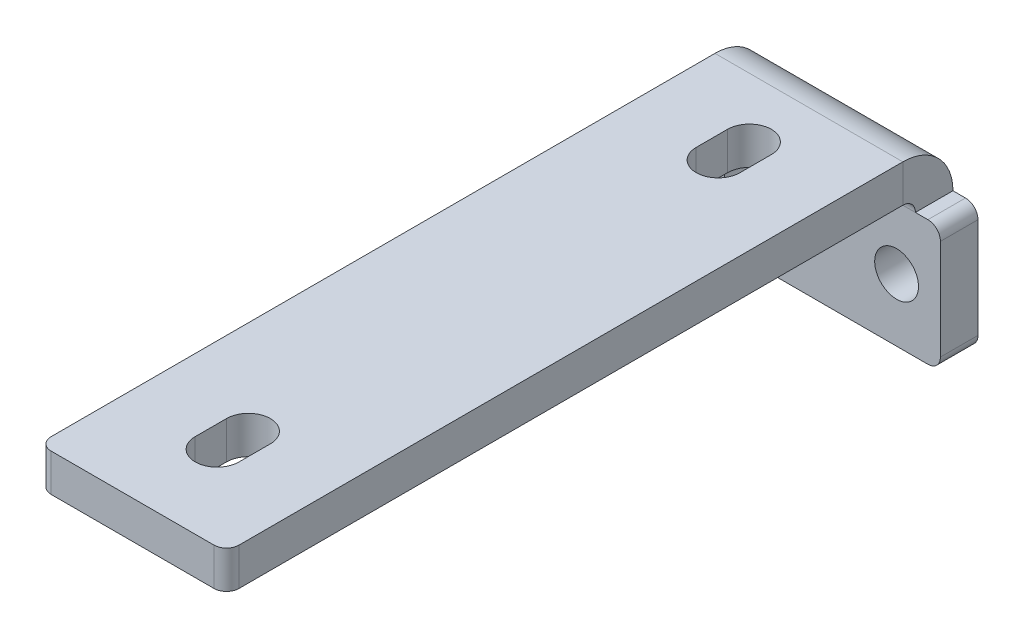
ISO-10303-21;
HEADER;
FILE_DESCRIPTION(('STEP AP214'),'2;1');
FILE_NAME('part.step','',(''),(''),'','','');
FILE_SCHEMA(('AUTOMOTIVE_DESIGN { 1 0 10303 214 1 1 1 1 }'));
ENDSEC;
DATA;
#1=APPLICATION_CONTEXT('core data for automotive mechanical design processes');
#2=APPLICATION_PROTOCOL_DEFINITION('international standard','automotive_design',2000,#1);
#3=PRODUCT_CONTEXT('',#1,'mechanical');
#4=PRODUCT('Part','Part','',(#3));
#5=PRODUCT_RELATED_PRODUCT_CATEGORY('part','',(#4));
#6=PRODUCT_DEFINITION_FORMATION('','',#4);
#7=PRODUCT_DEFINITION_CONTEXT('part definition',#1,'design');
#8=PRODUCT_DEFINITION('design','',#6,#7);
#9=PRODUCT_DEFINITION_SHAPE('','',#8);
#10=(LENGTH_UNIT() NAMED_UNIT(*) SI_UNIT(.MILLI.,.METRE.));
#11=(NAMED_UNIT(*) PLANE_ANGLE_UNIT() SI_UNIT($,.RADIAN.));
#12=(NAMED_UNIT(*) SI_UNIT($,.STERADIAN.) SOLID_ANGLE_UNIT());
#13=UNCERTAINTY_MEASURE_WITH_UNIT(LENGTH_MEASURE(1.E-05),#10,'distance_accuracy_value','');
#14=(GEOMETRIC_REPRESENTATION_CONTEXT(3) GLOBAL_UNCERTAINTY_ASSIGNED_CONTEXT((#13)) GLOBAL_UNIT_ASSIGNED_CONTEXT((#10,
#11,#12)) REPRESENTATION_CONTEXT('',''));
#15=CARTESIAN_POINT('',(0.,0.,0.));
#16=DIRECTION('',(0.,0.,1.));
#17=DIRECTION('',(1.,0.,0.));
#18=AXIS2_PLACEMENT_3D('',#15,#16,#17);
#19=CARTESIAN_POINT('',(0.,0.,-3.));
#20=DIRECTION('',(0.,1.,0.));
#21=DIRECTION('',(-1.,0.,0.));
#22=AXIS2_PLACEMENT_3D('',#19,#20,#21);
#23=PLANE('',#22);
#24=DIRECTION('',(-1.,0.,0.));
#25=VECTOR('',#24,1.);
#26=CARTESIAN_POINT('',(0.,0.,-3.));
#27=LINE('',#26,#25);
#28=CARTESIAN_POINT('',(2.,0.,-3.));
#29=VERTEX_POINT('',#28);
#30=CARTESIAN_POINT('',(1.,0.,-3.));
#31=VERTEX_POINT('',#30);
#32=EDGE_CURVE('E367',#29,#31,#27,.T.);
#33=ORIENTED_EDGE('',*,*,#32,.T.);
#34=DIRECTION('',(0.,0.,1.));
#35=VECTOR('',#34,1.);
#36=CARTESIAN_POINT('',(1.,0.,-3.));
#37=LINE('',#36,#35);
#38=CARTESIAN_POINT('',(1.,0.,0.));
#39=VERTEX_POINT('',#38);
#40=EDGE_CURVE('E348',#31,#39,#37,.T.);
#41=ORIENTED_EDGE('',*,*,#40,.T.);
#42=DIRECTION('',(-1.,0.,0.));
#43=VECTOR('',#42,1.);
#44=CARTESIAN_POINT('',(0.,0.,0.));
#45=LINE('',#44,#43);
#46=CARTESIAN_POINT('',(2.,0.,0.));
#47=VERTEX_POINT('',#46);
#48=EDGE_CURVE('E357',#47,#39,#45,.T.);
#49=ORIENTED_EDGE('',*,*,#48,.F.);
#50=DIRECTION('',(0.,0.,-1.));
#51=VECTOR('',#50,1.);
#52=CARTESIAN_POINT('',(2.,0.,0.));
#53=LINE('',#52,#51);
#54=EDGE_CURVE('E332',#47,#29,#53,.T.);
#55=ORIENTED_EDGE('',*,*,#54,.T.);
#56=EDGE_LOOP('',(#33,#41,#49,#55));
#57=FACE_BOUND('',#56,.T.);
#58=ADVANCED_FACE('F59',(#57),#23,.T.);
#59=CARTESIAN_POINT('',(0.,0.,-3.));
#60=DIRECTION('',(-1.,0.,0.));
#61=DIRECTION('',(0.,0.,1.));
#62=AXIS2_PLACEMENT_3D('',#59,#60,#61);
#63=PLANE('',#62);
#64=DIRECTION('',(0.,-1.,0.));
#65=VECTOR('',#64,1.);
#66=CARTESIAN_POINT('',(0.,0.,0.));
#67=LINE('',#66,#65);
#68=CARTESIAN_POINT('',(0.,-1.,0.));
#69=VERTEX_POINT('',#68);
#70=CARTESIAN_POINT('',(0.,-9.,0.));
#71=VERTEX_POINT('',#70);
#72=EDGE_CURVE('E377',#69,#71,#67,.T.);
#73=ORIENTED_EDGE('',*,*,#72,.F.);
#74=DIRECTION('',(0.,0.,1.));
#75=VECTOR('',#74,1.);
#76=CARTESIAN_POINT('',(0.,-1.,-3.));
#77=LINE('',#76,#75);
#78=CARTESIAN_POINT('',(0.,-1.,-3.));
#79=VERTEX_POINT('',#78);
#80=EDGE_CURVE('E382',#69,#79,#77,.F.);
#81=ORIENTED_EDGE('',*,*,#80,.T.);
#82=DIRECTION('',(0.,-1.,0.));
#83=VECTOR('',#82,1.);
#84=CARTESIAN_POINT('',(0.,0.,-3.));
#85=LINE('',#84,#83);
#86=CARTESIAN_POINT('',(0.,-9.,-3.));
#87=VERTEX_POINT('',#86);
#88=EDGE_CURVE('E356',#79,#87,#85,.T.);
#89=ORIENTED_EDGE('',*,*,#88,.T.);
#90=DIRECTION('',(0.,0.,1.));
#91=VECTOR('',#90,1.);
#92=CARTESIAN_POINT('',(0.,-9.,-3.));
#93=LINE('',#92,#91);
#94=EDGE_CURVE('E434',#87,#71,#93,.T.);
#95=ORIENTED_EDGE('',*,*,#94,.T.);
#96=EDGE_LOOP('',(#73,#81,#89,#95));
#97=FACE_BOUND('',#96,.T.);
#98=ADVANCED_FACE('F459',(#97),#63,.T.);
#99=CARTESIAN_POINT('',(18.,0.,0.));
#100=VERTEX_POINT('',#99);
#101=CARTESIAN_POINT('',(17.,0.,0.));
#102=VERTEX_POINT('',#101);
#103=EDGE_CURVE('E353',#100,#102,#45,.T.);
#104=ORIENTED_EDGE('',*,*,#103,.F.);
#105=DIRECTION('',(0.,0.,1.));
#106=VECTOR('',#105,1.);
#107=CARTESIAN_POINT('',(18.,0.,-3.));
#108=LINE('',#107,#106);
#109=CARTESIAN_POINT('',(18.,0.,-3.));
#110=VERTEX_POINT('',#109);
#111=EDGE_CURVE('E397',#100,#110,#108,.F.);
#112=ORIENTED_EDGE('',*,*,#111,.T.);
#113=CARTESIAN_POINT('',(17.,0.,-3.));
#114=VERTEX_POINT('',#113);
#115=EDGE_CURVE('E352',#110,#114,#27,.T.);
#116=ORIENTED_EDGE('',*,*,#115,.T.);
#117=DIRECTION('',(0.,0.,-1.));
#118=VECTOR('',#117,1.);
#119=CARTESIAN_POINT('',(17.,0.,0.));
#120=LINE('',#119,#118);
#121=EDGE_CURVE('E327',#102,#114,#120,.T.);
#122=ORIENTED_EDGE('',*,*,#121,.F.);
#123=EDGE_LOOP('',(#104,#112,#116,#122));
#124=FACE_BOUND('',#123,.T.);
#125=ADVANCED_FACE('F530',(#124),#23,.T.);
#126=CARTESIAN_POINT('',(19.,0.,-3.));
#127=DIRECTION('',(1.,0.,0.));
#128=DIRECTION('',(0.,0.,-1.));
#129=AXIS2_PLACEMENT_3D('',#126,#127,#128);
#130=PLANE('',#129);
#131=DIRECTION('',(0.,1.,0.));
#132=VECTOR('',#131,1.);
#133=CARTESIAN_POINT('',(19.,0.,-3.));
#134=LINE('',#133,#132);
#135=CARTESIAN_POINT('',(19.,-9.,-3.));
#136=VERTEX_POINT('',#135);
#137=CARTESIAN_POINT('',(19.,-1.,-3.));
#138=VERTEX_POINT('',#137);
#139=EDGE_CURVE('E371',#136,#138,#134,.T.);
#140=ORIENTED_EDGE('',*,*,#139,.T.);
#141=DIRECTION('',(0.,0.,1.));
#142=VECTOR('',#141,1.);
#143=CARTESIAN_POINT('',(19.,-1.,-3.));
#144=LINE('',#143,#142);
#145=CARTESIAN_POINT('',(19.,-1.,0.));
#146=VERTEX_POINT('',#145);
#147=EDGE_CURVE('E394',#138,#146,#144,.T.);
#148=ORIENTED_EDGE('',*,*,#147,.T.);
#149=DIRECTION('',(0.,1.,0.));
#150=VECTOR('',#149,1.);
#151=CARTESIAN_POINT('',(19.,0.,0.));
#152=LINE('',#151,#150);
#153=CARTESIAN_POINT('',(19.,-9.,0.));
#154=VERTEX_POINT('',#153);
#155=EDGE_CURVE('E362',#154,#146,#152,.T.);
#156=ORIENTED_EDGE('',*,*,#155,.F.);
#157=DIRECTION('',(0.,0.,1.));
#158=VECTOR('',#157,1.);
#159=CARTESIAN_POINT('',(19.,-9.,-3.));
#160=LINE('',#159,#158);
#161=EDGE_CURVE('E392',#154,#136,#160,.F.);
#162=ORIENTED_EDGE('',*,*,#161,.T.);
#163=EDGE_LOOP('',(#140,#148,#156,#162));
#164=FACE_BOUND('',#163,.T.);
#165=ADVANCED_FACE('F538',(#164),#130,.T.);
#166=CARTESIAN_POINT('',(0.,-10.,-3.));
#167=DIRECTION('',(0.,-1.,0.));
#168=DIRECTION('',(1.,0.,0.));
#169=AXIS2_PLACEMENT_3D('',#166,#167,#168);
#170=PLANE('',#169);
#171=DIRECTION('',(1.,0.,0.));
#172=VECTOR('',#171,1.);
#173=CARTESIAN_POINT('',(0.,-10.,-3.));
#174=LINE('',#173,#172);
#175=CARTESIAN_POINT('',(1.,-10.,-3.));
#176=VERTEX_POINT('',#175);
#177=CARTESIAN_POINT('',(18.,-10.,-3.));
#178=VERTEX_POINT('',#177);
#179=EDGE_CURVE('E420',#176,#178,#174,.T.);
#180=ORIENTED_EDGE('',*,*,#179,.T.);
#181=DIRECTION('',(0.,0.,1.));
#182=VECTOR('',#181,1.);
#183=CARTESIAN_POINT('',(18.,-10.,-3.));
#184=LINE('',#183,#182);
#185=CARTESIAN_POINT('',(18.,-10.,0.));
#186=VERTEX_POINT('',#185);
#187=EDGE_CURVE('E13',#178,#186,#184,.T.);
#188=ORIENTED_EDGE('',*,*,#187,.T.);
#189=DIRECTION('',(1.,0.,0.));
#190=VECTOR('',#189,1.);
#191=CARTESIAN_POINT('',(0.,-10.,0.));
#192=LINE('',#191,#190);
#193=CARTESIAN_POINT('',(1.,-10.,0.));
#194=VERTEX_POINT('',#193);
#195=EDGE_CURVE('E423',#194,#186,#192,.T.);
#196=ORIENTED_EDGE('',*,*,#195,.F.);
#197=DIRECTION('',(0.,0.,1.));
#198=VECTOR('',#197,1.);
#199=CARTESIAN_POINT('',(1.,-10.,-3.));
#200=LINE('',#199,#198);
#201=EDGE_CURVE('E67',#194,#176,#200,.F.);
#202=ORIENTED_EDGE('',*,*,#201,.T.);
#203=EDGE_LOOP('',(#180,#188,#196,#202));
#204=FACE_BOUND('',#203,.T.);
#205=ADVANCED_FACE('F419',(#204),#170,.T.);
#206=CARTESIAN_POINT('',(0.,0.,-3.));
#207=DIRECTION('',(0.,0.,1.));
#208=DIRECTION('',(1.,0.,0.));
#209=AXIS2_PLACEMENT_3D('',#206,#207,#208);
#210=PLANE('',#209);
#211=CARTESIAN_POINT('',(15.5,-5.,-3.));
#212=DIRECTION('',(0.,0.,1.));
#213=DIRECTION('',(-1.,0.,0.));
#214=AXIS2_PLACEMENT_3D('',#211,#212,#213);
#215=CIRCLE('',#214,1.75);
#216=CARTESIAN_POINT('',(13.75,-5.,-3.));
#217=VERTEX_POINT('',#216);
#218=EDGE_CURVE('E455',#217,#217,#215,.T.);
#219=ORIENTED_EDGE('',*,*,#218,.T.);
#220=EDGE_LOOP('',(#219));
#221=FACE_BOUND('',#220,.T.);
#222=CARTESIAN_POINT('',(3.5,-5.,-3.));
#223=DIRECTION('',(0.,0.,1.));
#224=DIRECTION('',(1.,0.,0.));
#225=AXIS2_PLACEMENT_3D('',#222,#223,#224);
#226=CIRCLE('',#225,1.75);
#227=CARTESIAN_POINT('',(5.25,-5.,-3.));
#228=VERTEX_POINT('',#227);
#229=EDGE_CURVE('E448',#228,#228,#226,.T.);
#230=ORIENTED_EDGE('',*,*,#229,.T.);
#231=EDGE_LOOP('',(#230));
#232=FACE_BOUND('',#231,.T.);
#233=ORIENTED_EDGE('',*,*,#88,.F.);
#234=CARTESIAN_POINT('',(1.,-1.,-3.));
#235=DIRECTION('',(0.,0.,1.));
#236=DIRECTION('',(1.,0.,0.));
#237=AXIS2_PLACEMENT_3D('',#234,#235,#236);
#238=CIRCLE('',#237,1.);
#239=EDGE_CURVE('E390',#79,#31,#238,.F.);
#240=ORIENTED_EDGE('',*,*,#239,.T.);
#241=ORIENTED_EDGE('',*,*,#32,.F.);
#242=DIRECTION('',(-1.,0.,0.));
#243=VECTOR('',#242,1.);
#244=CARTESIAN_POINT('',(2.,0.,-3.));
#245=LINE('',#244,#243);
#246=EDGE_CURVE('E345',#29,#114,#245,.F.);
#247=ORIENTED_EDGE('',*,*,#246,.T.);
#248=ORIENTED_EDGE('',*,*,#115,.F.);
#249=CARTESIAN_POINT('',(18.,-1.,-3.));
#250=DIRECTION('',(0.,0.,1.));
#251=DIRECTION('',(1.,0.,0.));
#252=AXIS2_PLACEMENT_3D('',#249,#250,#251);
#253=CIRCLE('',#252,1.);
#254=EDGE_CURVE('E388',#110,#138,#253,.F.);
#255=ORIENTED_EDGE('',*,*,#254,.T.);
#256=ORIENTED_EDGE('',*,*,#139,.F.);
#257=CARTESIAN_POINT('',(18.,-9.,-3.));
#258=DIRECTION('',(0.,0.,1.));
#259=DIRECTION('',(1.,0.,0.));
#260=AXIS2_PLACEMENT_3D('',#257,#258,#259);
#261=CIRCLE('',#260,1.);
#262=EDGE_CURVE('E386',#136,#178,#261,.F.);
#263=ORIENTED_EDGE('',*,*,#262,.T.);
#264=ORIENTED_EDGE('',*,*,#179,.F.);
#265=CARTESIAN_POINT('',(1.,-9.,-3.));
#266=DIRECTION('',(0.,0.,1.));
#267=DIRECTION('',(1.,0.,0.));
#268=AXIS2_PLACEMENT_3D('',#265,#266,#267);
#269=CIRCLE('',#268,1.);
#270=EDGE_CURVE('E384',#176,#87,#269,.F.);
#271=ORIENTED_EDGE('',*,*,#270,.T.);
#272=EDGE_LOOP('',(#233,#240,#241,#247,#248,#255,#256,#263,#264,#271));
#273=FACE_BOUND('',#272,.T.);
#274=ADVANCED_FACE('F428',(#221,#232,#273),#210,.F.);
#275=CARTESIAN_POINT('',(0.,0.,0.));
#276=DIRECTION('',(0.,0.,1.));
#277=DIRECTION('',(1.,0.,0.));
#278=AXIS2_PLACEMENT_3D('',#275,#276,#277);
#279=PLANE('',#278);
#280=CARTESIAN_POINT('',(15.5,-5.,0.));
#281=DIRECTION('',(0.,0.,1.));
#282=DIRECTION('',(-1.,0.,0.));
#283=AXIS2_PLACEMENT_3D('',#280,#281,#282);
#284=CIRCLE('',#283,1.75);
#285=CARTESIAN_POINT('',(13.75,-5.,0.));
#286=VERTEX_POINT('',#285);
#287=EDGE_CURVE('E331',#286,#286,#284,.T.);
#288=ORIENTED_EDGE('',*,*,#287,.F.);
#289=EDGE_LOOP('',(#288));
#290=FACE_BOUND('',#289,.T.);
#291=CARTESIAN_POINT('',(3.5,-5.,0.));
#292=DIRECTION('',(0.,0.,1.));
#293=DIRECTION('',(1.,0.,0.));
#294=AXIS2_PLACEMENT_3D('',#291,#292,#293);
#295=CIRCLE('',#294,1.75);
#296=CARTESIAN_POINT('',(5.25,-5.,0.));
#297=VERTEX_POINT('',#296);
#298=EDGE_CURVE('E450',#297,#297,#295,.T.);
#299=ORIENTED_EDGE('',*,*,#298,.F.);
#300=EDGE_LOOP('',(#299));
#301=FACE_BOUND('',#300,.T.);
#302=ORIENTED_EDGE('',*,*,#48,.T.);
#303=CARTESIAN_POINT('',(1.,-1.,0.));
#304=DIRECTION('',(0.,0.,1.));
#305=DIRECTION('',(1.,0.,0.));
#306=AXIS2_PLACEMENT_3D('',#303,#304,#305);
#307=CIRCLE('',#306,1.);
#308=EDGE_CURVE('E438',#39,#69,#307,.T.);
#309=ORIENTED_EDGE('',*,*,#308,.T.);
#310=ORIENTED_EDGE('',*,*,#72,.T.);
#311=CARTESIAN_POINT('',(1.,-9.,0.));
#312=DIRECTION('',(0.,0.,1.));
#313=DIRECTION('',(1.,0.,0.));
#314=AXIS2_PLACEMENT_3D('',#311,#312,#313);
#315=CIRCLE('',#314,1.);
#316=EDGE_CURVE('E351',#71,#194,#315,.T.);
#317=ORIENTED_EDGE('',*,*,#316,.T.);
#318=ORIENTED_EDGE('',*,*,#195,.T.);
#319=CARTESIAN_POINT('',(18.,-9.,0.));
#320=DIRECTION('',(0.,0.,1.));
#321=DIRECTION('',(1.,0.,0.));
#322=AXIS2_PLACEMENT_3D('',#319,#320,#321);
#323=CIRCLE('',#322,1.);
#324=EDGE_CURVE('E442',#186,#154,#323,.T.);
#325=ORIENTED_EDGE('',*,*,#324,.T.);
#326=ORIENTED_EDGE('',*,*,#155,.T.);
#327=CARTESIAN_POINT('',(18.,-1.,0.));
#328=DIRECTION('',(0.,0.,1.));
#329=DIRECTION('',(1.,0.,0.));
#330=AXIS2_PLACEMENT_3D('',#327,#328,#329);
#331=CIRCLE('',#330,1.);
#332=EDGE_CURVE('E439',#146,#100,#331,.T.);
#333=ORIENTED_EDGE('',*,*,#332,.T.);
#334=ORIENTED_EDGE('',*,*,#103,.T.);
#335=DIRECTION('',(-1.,0.,0.));
#336=VECTOR('',#335,1.);
#337=CARTESIAN_POINT('',(2.,0.,0.));
#338=LINE('',#337,#336);
#339=EDGE_CURVE('E339',#47,#102,#338,.F.);
#340=ORIENTED_EDGE('',*,*,#339,.F.);
#341=EDGE_LOOP('',(#302,#309,#310,#317,#318,#325,#326,#333,#334,#340));
#342=FACE_BOUND('',#341,.T.);
#343=ADVANCED_FACE('F446',(#290,#301,#342),#279,.T.);
#344=CARTESIAN_POINT('',(3.5,-5.,-3.));
#345=DIRECTION('',(0.,0.,1.));
#346=DIRECTION('',(1.,0.,0.));
#347=AXIS2_PLACEMENT_3D('',#344,#345,#346);
#348=CYLINDRICAL_SURFACE('',#347,1.75);
#349=ORIENTED_EDGE('',*,*,#229,.F.);
#350=EDGE_LOOP('',(#349));
#351=FACE_BOUND('',#350,.T.);
#352=ORIENTED_EDGE('',*,*,#298,.T.);
#353=EDGE_LOOP('',(#352));
#354=FACE_BOUND('',#353,.T.);
#355=ADVANCED_FACE('F566',(#351,#354),#348,.F.);
#356=CARTESIAN_POINT('',(15.5,-5.,-3.));
#357=DIRECTION('',(0.,0.,1.));
#358=DIRECTION('',(1.,0.,0.));
#359=AXIS2_PLACEMENT_3D('',#356,#357,#358);
#360=CYLINDRICAL_SURFACE('',#359,1.75);
#361=ORIENTED_EDGE('',*,*,#218,.F.);
#362=EDGE_LOOP('',(#361));
#363=FACE_BOUND('',#362,.T.);
#364=ORIENTED_EDGE('',*,*,#287,.T.);
#365=EDGE_LOOP('',(#364));
#366=FACE_BOUND('',#365,.T.);
#367=ADVANCED_FACE('F572',(#363,#366),#360,.F.);
#368=CARTESIAN_POINT('',(17.,0.,1.));
#369=DIRECTION('',(1.,0.,0.));
#370=DIRECTION('',(0.,1.,0.));
#371=AXIS2_PLACEMENT_3D('',#368,#369,#370);
#372=PLANE('',#371);
#373=DIRECTION('',(0.,-1.,0.));
#374=VECTOR('',#373,1.);
#375=CARTESIAN_POINT('',(17.,4.,0.999999999999986));
#376=LINE('',#375,#374);
#377=CARTESIAN_POINT('',(17.,0.999999999999998,0.999999999999996));
#378=VERTEX_POINT('',#377);
#379=CARTESIAN_POINT('',(17.,4.,0.999999999999986));
#380=VERTEX_POINT('',#379);
#381=EDGE_CURVE('E297',#378,#380,#376,.F.);
#382=ORIENTED_EDGE('',*,*,#381,.F.);
#383=CARTESIAN_POINT('',(17.,0.,1.));
#384=DIRECTION('',(-1.,0.,0.));
#385=DIRECTION('',(0.,-1.,0.));
#386=AXIS2_PLACEMENT_3D('',#383,#384,#385);
#387=CIRCLE('',#386,1.);
#388=EDGE_CURVE('E335',#102,#378,#387,.F.);
#389=ORIENTED_EDGE('',*,*,#388,.F.);
#390=ORIENTED_EDGE('',*,*,#121,.T.);
#391=CARTESIAN_POINT('',(17.,0.,1.));
#392=DIRECTION('',(-1.,0.,0.));
#393=DIRECTION('',(0.,-1.,0.));
#394=AXIS2_PLACEMENT_3D('',#391,#392,#393);
#395=CIRCLE('',#394,4.);
#396=EDGE_CURVE('E342',#114,#380,#395,.F.);
#397=ORIENTED_EDGE('',*,*,#396,.T.);
#398=EDGE_LOOP('',(#382,#389,#390,#397));
#399=FACE_BOUND('',#398,.T.);
#400=ADVANCED_FACE('F495',(#399),#372,.T.);
#401=CARTESIAN_POINT('',(2.,0.,1.));
#402=DIRECTION('',(1.,0.,0.));
#403=DIRECTION('',(0.,1.,0.));
#404=AXIS2_PLACEMENT_3D('',#401,#402,#403);
#405=PLANE('',#404);
#406=CARTESIAN_POINT('',(2.,0.,1.));
#407=DIRECTION('',(-1.,0.,0.));
#408=DIRECTION('',(0.,-1.,0.));
#409=AXIS2_PLACEMENT_3D('',#406,#407,#408);
#410=CIRCLE('',#409,1.);
#411=CARTESIAN_POINT('',(2.,1.,0.999999999999996));
#412=VERTEX_POINT('',#411);
#413=EDGE_CURVE('E300',#412,#47,#410,.T.);
#414=ORIENTED_EDGE('',*,*,#413,.F.);
#415=DIRECTION('',(0.,-1.,0.));
#416=VECTOR('',#415,1.);
#417=CARTESIAN_POINT('',(2.,1.,0.999999999999995));
#418=LINE('',#417,#416);
#419=CARTESIAN_POINT('',(2.,4.,0.999999999999985));
#420=VERTEX_POINT('',#419);
#421=EDGE_CURVE('E315',#412,#420,#418,.F.);
#422=ORIENTED_EDGE('',*,*,#421,.T.);
#423=CARTESIAN_POINT('',(2.,0.,1.));
#424=DIRECTION('',(-1.,0.,0.));
#425=DIRECTION('',(0.,-1.,0.));
#426=AXIS2_PLACEMENT_3D('',#423,#424,#425);
#427=CIRCLE('',#426,4.);
#428=EDGE_CURVE('E338',#420,#29,#427,.T.);
#429=ORIENTED_EDGE('',*,*,#428,.T.);
#430=ORIENTED_EDGE('',*,*,#54,.F.);
#431=EDGE_LOOP('',(#414,#422,#429,#430));
#432=FACE_BOUND('',#431,.T.);
#433=ADVANCED_FACE('F487',(#432),#405,.F.);
#434=CARTESIAN_POINT('',(2.,0.,1.));
#435=DIRECTION('',(-1.,0.,0.));
#436=DIRECTION('',(0.,1.,0.));
#437=AXIS2_PLACEMENT_3D('',#434,#435,#436);
#438=CYLINDRICAL_SURFACE('',#437,4.);
#439=ORIENTED_EDGE('',*,*,#246,.F.);
#440=ORIENTED_EDGE('',*,*,#428,.F.);
#441=DIRECTION('',(-1.,0.,0.));
#442=VECTOR('',#441,1.);
#443=CARTESIAN_POINT('',(17.,4.,0.999999999999986));
#444=LINE('',#443,#442);
#445=EDGE_CURVE('E312',#420,#380,#444,.F.);
#446=ORIENTED_EDGE('',*,*,#445,.T.);
#447=ORIENTED_EDGE('',*,*,#396,.F.);
#448=EDGE_LOOP('',(#439,#440,#446,#447));
#449=FACE_BOUND('',#448,.T.);
#450=ADVANCED_FACE('F492',(#449),#438,.T.);
#451=CARTESIAN_POINT('',(2.,0.,1.));
#452=DIRECTION('',(-1.,0.,0.));
#453=DIRECTION('',(0.,1.,0.));
#454=AXIS2_PLACEMENT_3D('',#451,#452,#453);
#455=CYLINDRICAL_SURFACE('',#454,1.);
#456=ORIENTED_EDGE('',*,*,#339,.T.);
#457=ORIENTED_EDGE('',*,*,#388,.T.);
#458=DIRECTION('',(-1.,0.,0.));
#459=VECTOR('',#458,1.);
#460=CARTESIAN_POINT('',(17.,0.999999999999999,0.999999999999997));
#461=LINE('',#460,#459);
#462=EDGE_CURVE('E318',#378,#412,#461,.T.);
#463=ORIENTED_EDGE('',*,*,#462,.T.);
#464=ORIENTED_EDGE('',*,*,#413,.T.);
#465=EDGE_LOOP('',(#456,#457,#463,#464));
#466=FACE_BOUND('',#465,.T.);
#467=ADVANCED_FACE('F505',(#466),#455,.F.);
#468=CARTESIAN_POINT('',(2.,4.,0.));
#469=DIRECTION('',(1.,0.,0.));
#470=DIRECTION('',(0.,1.,0.));
#471=AXIS2_PLACEMENT_3D('',#468,#469,#470);
#472=PLANE('',#471);
#473=DIRECTION('',(0.,0.,-1.));
#474=VECTOR('',#473,1.);
#475=CARTESIAN_POINT('',(2.,0.999999999999997,0.));
#476=LINE('',#475,#474);
#477=CARTESIAN_POINT('',(2.,1.00000000000018,54.));
#478=VERTEX_POINT('',#477);
#479=EDGE_CURVE('E310',#412,#478,#476,.F.);
#480=ORIENTED_EDGE('',*,*,#479,.T.);
#481=DIRECTION('',(0.,-1.,0.));
#482=VECTOR('',#481,1.);
#483=CARTESIAN_POINT('',(2.,4.00000000000018,54.));
#484=LINE('',#483,#482);
#485=CARTESIAN_POINT('',(2.,4.00000000000018,54.));
#486=VERTEX_POINT('',#485);
#487=EDGE_CURVE('E82',#478,#486,#484,.F.);
#488=ORIENTED_EDGE('',*,*,#487,.T.);
#489=DIRECTION('',(0.,0.,1.));
#490=VECTOR('',#489,1.);
#491=CARTESIAN_POINT('',(2.,4.,0.));
#492=LINE('',#491,#490);
#493=EDGE_CURVE('E303',#420,#486,#492,.T.);
#494=ORIENTED_EDGE('',*,*,#493,.F.);
#495=ORIENTED_EDGE('',*,*,#421,.F.);
#496=EDGE_LOOP('',(#480,#488,#494,#495));
#497=FACE_BOUND('',#496,.T.);
#498=ADVANCED_FACE('F506',(#497),#472,.F.);
#499=CARTESIAN_POINT('',(17.,3.99999999999999,0.));
#500=DIRECTION('',(-1.,0.,0.));
#501=DIRECTION('',(0.,-1.,0.));
#502=AXIS2_PLACEMENT_3D('',#499,#500,#501);
#503=PLANE('',#502);
#504=DIRECTION('',(0.,0.,-1.));
#505=VECTOR('',#504,1.);
#506=CARTESIAN_POINT('',(17.,3.99999999999999,0.));
#507=LINE('',#506,#505);
#508=CARTESIAN_POINT('',(17.,4.00000000000018,54.));
#509=VERTEX_POINT('',#508);
#510=EDGE_CURVE('E298',#509,#380,#507,.T.);
#511=ORIENTED_EDGE('',*,*,#510,.F.);
#512=DIRECTION('',(0.,-1.,0.));
#513=VECTOR('',#512,1.);
#514=CARTESIAN_POINT('',(17.,4.00000000000018,54.));
#515=LINE('',#514,#513);
#516=CARTESIAN_POINT('',(17.,1.00000000000018,54.));
#517=VERTEX_POINT('',#516);
#518=EDGE_CURVE('E412',#509,#517,#515,.T.);
#519=ORIENTED_EDGE('',*,*,#518,.T.);
#520=DIRECTION('',(0.,0.,1.));
#521=VECTOR('',#520,1.);
#522=CARTESIAN_POINT('',(17.,0.999999999999995,0.));
#523=LINE('',#522,#521);
#524=EDGE_CURVE('E305',#517,#378,#523,.F.);
#525=ORIENTED_EDGE('',*,*,#524,.T.);
#526=ORIENTED_EDGE('',*,*,#381,.T.);
#527=EDGE_LOOP('',(#511,#519,#525,#526));
#528=FACE_BOUND('',#527,.T.);
#529=ADVANCED_FACE('F498',(#528),#503,.F.);
#530=CARTESIAN_POINT('',(0.,4.,0.));
#531=DIRECTION('',(0.,-1.,0.));
#532=DIRECTION('',(0.,0.,-1.));
#533=AXIS2_PLACEMENT_3D('',#530,#531,#532);
#534=PLANE('',#533);
#535=DIRECTION('',(0.,0.,-1.));
#536=VECTOR('',#535,1.);
#537=CARTESIAN_POINT('',(11.25,4.00000000000016,48.25));
#538=LINE('',#537,#536);
#539=CARTESIAN_POINT('',(11.25,4.00000000000016,48.25));
#540=VERTEX_POINT('',#539);
#541=CARTESIAN_POINT('',(11.25,4.00000000000016,45.75));
#542=VERTEX_POINT('',#541);
#543=EDGE_CURVE('E250',#540,#542,#538,.T.);
#544=ORIENTED_EDGE('',*,*,#543,.F.);
#545=CARTESIAN_POINT('',(9.50000000000001,4.00000000000016,48.25));
#546=DIRECTION('',(0.,1.,0.));
#547=DIRECTION('',(0.,0.,1.));
#548=AXIS2_PLACEMENT_3D('',#545,#546,#547);
#549=CIRCLE('',#548,1.74999999999999);
#550=CARTESIAN_POINT('',(7.75000000000001,4.00000000000016,48.25));
#551=VERTEX_POINT('',#550);
#552=EDGE_CURVE('E242',#551,#540,#549,.T.);
#553=ORIENTED_EDGE('',*,*,#552,.F.);
#554=DIRECTION('',(0.,0.,1.));
#555=VECTOR('',#554,1.);
#556=CARTESIAN_POINT('',(7.75000000000001,4.00000000000016,48.25));
#557=LINE('',#556,#555);
#558=CARTESIAN_POINT('',(7.75000000000001,4.00000000000016,45.75));
#559=VERTEX_POINT('',#558);
#560=EDGE_CURVE('E243',#559,#551,#557,.T.);
#561=ORIENTED_EDGE('',*,*,#560,.F.);
#562=CARTESIAN_POINT('',(9.50000000000001,4.00000000000016,45.75));
#563=DIRECTION('',(0.,1.,0.));
#564=DIRECTION('',(0.,0.,1.));
#565=AXIS2_PLACEMENT_3D('',#562,#563,#564);
#566=CIRCLE('',#565,1.75);
#567=EDGE_CURVE('E257',#542,#559,#566,.T.);
#568=ORIENTED_EDGE('',*,*,#567,.F.);
#569=EDGE_LOOP('',(#544,#553,#561,#568));
#570=FACE_BOUND('',#569,.T.);
#571=DIRECTION('',(0.,0.,-1.));
#572=VECTOR('',#571,1.);
#573=CARTESIAN_POINT('',(11.25,4.00000000000002,8.24999999999999));
#574=LINE('',#573,#572);
#575=CARTESIAN_POINT('',(11.25,4.00000000000002,8.25));
#576=VERTEX_POINT('',#575);
#577=CARTESIAN_POINT('',(11.25,4.00000000000002,5.74999999999999));
#578=VERTEX_POINT('',#577);
#579=EDGE_CURVE('E276',#576,#578,#574,.T.);
#580=ORIENTED_EDGE('',*,*,#579,.F.);
#581=CARTESIAN_POINT('',(9.5,4.00000000000002,8.24999999999999));
#582=DIRECTION('',(0.,1.,0.));
#583=DIRECTION('',(0.,0.,1.));
#584=AXIS2_PLACEMENT_3D('',#581,#582,#583);
#585=CIRCLE('',#584,1.75);
#586=CARTESIAN_POINT('',(7.75,4.00000000000002,8.24999999999999));
#587=VERTEX_POINT('',#586);
#588=EDGE_CURVE('E274',#587,#576,#585,.T.);
#589=ORIENTED_EDGE('',*,*,#588,.F.);
#590=DIRECTION('',(0.,0.,1.));
#591=VECTOR('',#590,1.);
#592=CARTESIAN_POINT('',(7.75,4.00000000000002,8.24999999999999));
#593=LINE('',#592,#591);
#594=CARTESIAN_POINT('',(7.75,4.00000000000002,5.74999999999999));
#595=VERTEX_POINT('',#594);
#596=EDGE_CURVE('E282',#595,#587,#593,.T.);
#597=ORIENTED_EDGE('',*,*,#596,.F.);
#598=CARTESIAN_POINT('',(9.5,4.00000000000002,5.74999999999999));
#599=DIRECTION('',(0.,1.,0.));
#600=DIRECTION('',(0.,0.,1.));
#601=AXIS2_PLACEMENT_3D('',#598,#599,#600);
#602=CIRCLE('',#601,1.75);
#603=EDGE_CURVE('E279',#578,#595,#602,.T.);
#604=ORIENTED_EDGE('',*,*,#603,.F.);
#605=EDGE_LOOP('',(#580,#589,#597,#604));
#606=FACE_BOUND('',#605,.T.);
#607=ORIENTED_EDGE('',*,*,#493,.T.);
#608=CARTESIAN_POINT('',(3.,4.00000000000018,54.));
#609=DIRECTION('',(0.,-1.,0.));
#610=DIRECTION('',(0.,0.,-1.));
#611=AXIS2_PLACEMENT_3D('',#608,#609,#610);
#612=CIRCLE('',#611,1.);
#613=CARTESIAN_POINT('',(3.,4.00000000000019,55.));
#614=VERTEX_POINT('',#613);
#615=EDGE_CURVE('E410',#486,#614,#612,.F.);
#616=ORIENTED_EDGE('',*,*,#615,.T.);
#617=DIRECTION('',(1.,0.,0.));
#618=VECTOR('',#617,1.);
#619=CARTESIAN_POINT('',(0.,4.00000000000019,55.));
#620=LINE('',#619,#618);
#621=CARTESIAN_POINT('',(16.,4.00000000000019,55.));
#622=VERTEX_POINT('',#621);
#623=EDGE_CURVE('E301',#614,#622,#620,.T.);
#624=ORIENTED_EDGE('',*,*,#623,.T.);
#625=CARTESIAN_POINT('',(16.,4.00000000000018,54.));
#626=DIRECTION('',(0.,-1.,0.));
#627=DIRECTION('',(0.,0.,-1.));
#628=AXIS2_PLACEMENT_3D('',#625,#626,#627);
#629=CIRCLE('',#628,1.);
#630=EDGE_CURVE('E74',#622,#509,#629,.F.);
#631=ORIENTED_EDGE('',*,*,#630,.T.);
#632=ORIENTED_EDGE('',*,*,#510,.T.);
#633=ORIENTED_EDGE('',*,*,#445,.F.);
#634=EDGE_LOOP('',(#607,#616,#624,#631,#632,#633));
#635=FACE_BOUND('',#634,.T.);
#636=ADVANCED_FACE('F508',(#570,#606,#635),#534,.F.);
#637=CARTESIAN_POINT('',(0.,0.999999999999997,0.));
#638=DIRECTION('',(0.,-1.,0.));
#639=DIRECTION('',(0.,0.,-1.));
#640=AXIS2_PLACEMENT_3D('',#637,#638,#639);
#641=PLANE('',#640);
#642=CARTESIAN_POINT('',(9.50000000000001,1.00000000000017,48.25));
#643=DIRECTION('',(0.,-1.,0.));
#644=DIRECTION('',(0.,0.,-1.));
#645=AXIS2_PLACEMENT_3D('',#642,#643,#644);
#646=CIRCLE('',#645,1.74999999999999);
#647=CARTESIAN_POINT('',(7.75000000000001,1.00000000000017,48.25));
#648=VERTEX_POINT('',#647);
#649=CARTESIAN_POINT('',(11.25,1.00000000000016,48.25));
#650=VERTEX_POINT('',#649);
#651=EDGE_CURVE('E239',#648,#650,#646,.F.);
#652=ORIENTED_EDGE('',*,*,#651,.T.);
#653=DIRECTION('',(0.,0.,-1.));
#654=VECTOR('',#653,1.);
#655=CARTESIAN_POINT('',(11.25,1.00000000000016,48.25));
#656=LINE('',#655,#654);
#657=CARTESIAN_POINT('',(11.25,1.00000000000016,45.75));
#658=VERTEX_POINT('',#657);
#659=EDGE_CURVE('E223',#650,#658,#656,.T.);
#660=ORIENTED_EDGE('',*,*,#659,.T.);
#661=CARTESIAN_POINT('',(9.50000000000001,1.00000000000016,45.75));
#662=DIRECTION('',(0.,-1.,0.));
#663=DIRECTION('',(0.,0.,-1.));
#664=AXIS2_PLACEMENT_3D('',#661,#662,#663);
#665=CIRCLE('',#664,1.75);
#666=CARTESIAN_POINT('',(7.75000000000001,1.00000000000016,45.75));
#667=VERTEX_POINT('',#666);
#668=EDGE_CURVE('E252',#658,#667,#665,.F.);
#669=ORIENTED_EDGE('',*,*,#668,.T.);
#670=DIRECTION('',(0.,0.,1.));
#671=VECTOR('',#670,1.);
#672=CARTESIAN_POINT('',(7.75000000000001,1.00000000000017,48.25));
#673=LINE('',#672,#671);
#674=EDGE_CURVE('E248',#667,#648,#673,.T.);
#675=ORIENTED_EDGE('',*,*,#674,.T.);
#676=EDGE_LOOP('',(#652,#660,#669,#675));
#677=FACE_BOUND('',#676,.T.);
#678=CARTESIAN_POINT('',(9.5,1.00000000000003,8.25));
#679=DIRECTION('',(0.,-1.,0.));
#680=DIRECTION('',(0.,0.,-1.));
#681=AXIS2_PLACEMENT_3D('',#678,#679,#680);
#682=CIRCLE('',#681,1.75);
#683=CARTESIAN_POINT('',(7.75,1.00000000000003,8.25000000000004));
#684=VERTEX_POINT('',#683);
#685=CARTESIAN_POINT('',(11.25,1.00000000000003,8.25000000000004));
#686=VERTEX_POINT('',#685);
#687=EDGE_CURVE('E271',#684,#686,#682,.F.);
#688=ORIENTED_EDGE('',*,*,#687,.T.);
#689=DIRECTION('',(0.,0.,-1.));
#690=VECTOR('',#689,1.);
#691=CARTESIAN_POINT('',(11.25,1.00000000000003,8.25));
#692=LINE('',#691,#690);
#693=CARTESIAN_POINT('',(11.25,1.00000000000002,5.74999999999999));
#694=VERTEX_POINT('',#693);
#695=EDGE_CURVE('E288',#686,#694,#692,.T.);
#696=ORIENTED_EDGE('',*,*,#695,.T.);
#697=CARTESIAN_POINT('',(9.5,1.00000000000002,5.75));
#698=DIRECTION('',(0.,-1.,0.));
#699=DIRECTION('',(0.,0.,-1.));
#700=AXIS2_PLACEMENT_3D('',#697,#698,#699);
#701=CIRCLE('',#700,1.75);
#702=CARTESIAN_POINT('',(7.75,1.00000000000002,5.75000000000002));
#703=VERTEX_POINT('',#702);
#704=EDGE_CURVE('E234',#694,#703,#701,.F.);
#705=ORIENTED_EDGE('',*,*,#704,.T.);
#706=DIRECTION('',(0.,0.,1.));
#707=VECTOR('',#706,1.);
#708=CARTESIAN_POINT('',(7.75,1.00000000000003,8.25));
#709=LINE('',#708,#707);
#710=EDGE_CURVE('E268',#703,#684,#709,.T.);
#711=ORIENTED_EDGE('',*,*,#710,.T.);
#712=EDGE_LOOP('',(#688,#696,#705,#711));
#713=FACE_BOUND('',#712,.T.);
#714=DIRECTION('',(-1.,0.,0.));
#715=VECTOR('',#714,1.);
#716=CARTESIAN_POINT('',(17.,1.00000000000019,55.));
#717=LINE('',#716,#715);
#718=CARTESIAN_POINT('',(3.,1.00000000000019,55.));
#719=VERTEX_POINT('',#718);
#720=CARTESIAN_POINT('',(16.,1.00000000000019,55.));
#721=VERTEX_POINT('',#720);
#722=EDGE_CURVE('E307',#719,#721,#717,.F.);
#723=ORIENTED_EDGE('',*,*,#722,.F.);
#724=CARTESIAN_POINT('',(3.,1.00000000000018,54.));
#725=DIRECTION('',(0.,-1.,0.));
#726=DIRECTION('',(0.,0.,-1.));
#727=AXIS2_PLACEMENT_3D('',#724,#725,#726);
#728=CIRCLE('',#727,1.);
#729=EDGE_CURVE('E406',#719,#478,#728,.T.);
#730=ORIENTED_EDGE('',*,*,#729,.T.);
#731=ORIENTED_EDGE('',*,*,#479,.F.);
#732=ORIENTED_EDGE('',*,*,#462,.F.);
#733=ORIENTED_EDGE('',*,*,#524,.F.);
#734=CARTESIAN_POINT('',(16.,1.00000000000018,54.));
#735=DIRECTION('',(0.,-1.,0.));
#736=DIRECTION('',(0.,0.,-1.));
#737=AXIS2_PLACEMENT_3D('',#734,#735,#736);
#738=CIRCLE('',#737,1.);
#739=EDGE_CURVE('E404',#517,#721,#738,.T.);
#740=ORIENTED_EDGE('',*,*,#739,.T.);
#741=EDGE_LOOP('',(#723,#730,#731,#732,#733,#740));
#742=FACE_BOUND('',#741,.T.);
#743=ADVANCED_FACE('F246',(#677,#713,#742),#641,.T.);
#744=CARTESIAN_POINT('',(17.,4.00000000000019,55.));
#745=DIRECTION('',(0.,0.,-1.));
#746=DIRECTION('',(0.,1.,0.));
#747=AXIS2_PLACEMENT_3D('',#744,#745,#746);
#748=PLANE('',#747);
#749=ORIENTED_EDGE('',*,*,#623,.F.);
#750=DIRECTION('',(0.,-1.,0.));
#751=VECTOR('',#750,1.);
#752=CARTESIAN_POINT('',(3.,4.00000000000019,55.));
#753=LINE('',#752,#751);
#754=EDGE_CURVE('E401',#614,#719,#753,.T.);
#755=ORIENTED_EDGE('',*,*,#754,.T.);
#756=ORIENTED_EDGE('',*,*,#722,.T.);
#757=DIRECTION('',(0.,-1.,0.));
#758=VECTOR('',#757,1.);
#759=CARTESIAN_POINT('',(16.,4.00000000000019,55.));
#760=LINE('',#759,#758);
#761=EDGE_CURVE('E399',#721,#622,#760,.F.);
#762=ORIENTED_EDGE('',*,*,#761,.T.);
#763=EDGE_LOOP('',(#749,#755,#756,#762));
#764=FACE_BOUND('',#763,.T.);
#765=ADVANCED_FACE('F514',(#764),#748,.F.);
#766=CARTESIAN_POINT('',(9.5,-10.0010000000002,8.25000000000004));
#767=DIRECTION('',(0.,1.,0.));
#768=DIRECTION('',(0.,0.,1.));
#769=AXIS2_PLACEMENT_3D('',#766,#767,#768);
#770=CYLINDRICAL_SURFACE('',#769,1.75);
#771=DIRECTION('',(0.,1.,0.));
#772=VECTOR('',#771,1.);
#773=CARTESIAN_POINT('',(7.75,-10.0010000000002,8.25000000000004));
#774=LINE('',#773,#772);
#775=EDGE_CURVE('E286',#684,#587,#774,.T.);
#776=ORIENTED_EDGE('',*,*,#775,.T.);
#777=ORIENTED_EDGE('',*,*,#588,.T.);
#778=DIRECTION('',(0.,1.,0.));
#779=VECTOR('',#778,1.);
#780=CARTESIAN_POINT('',(11.25,-10.0010000000002,8.25000000000004));
#781=LINE('',#780,#779);
#782=EDGE_CURVE('E285',#686,#576,#781,.T.);
#783=ORIENTED_EDGE('',*,*,#782,.F.);
#784=ORIENTED_EDGE('',*,*,#687,.F.);
#785=EDGE_LOOP('',(#776,#777,#783,#784));
#786=FACE_BOUND('',#785,.T.);
#787=ADVANCED_FACE('F589',(#786),#770,.F.);
#788=CARTESIAN_POINT('',(7.75,-10.0010000000002,8.25000000000004));
#789=DIRECTION('',(-1.,0.,0.));
#790=DIRECTION('',(0.,0.,1.));
#791=AXIS2_PLACEMENT_3D('',#788,#789,#790);
#792=PLANE('',#791);
#793=DIRECTION('',(0.,1.,0.));
#794=VECTOR('',#793,1.);
#795=CARTESIAN_POINT('',(7.75,-10.0010000000002,5.75000000000004));
#796=LINE('',#795,#794);
#797=EDGE_CURVE('E289',#703,#595,#796,.T.);
#798=ORIENTED_EDGE('',*,*,#797,.T.);
#799=ORIENTED_EDGE('',*,*,#596,.T.);
#800=ORIENTED_EDGE('',*,*,#775,.F.);
#801=ORIENTED_EDGE('',*,*,#710,.F.);
#802=EDGE_LOOP('',(#798,#799,#800,#801));
#803=FACE_BOUND('',#802,.T.);
#804=ADVANCED_FACE('F599',(#803),#792,.F.);
#805=CARTESIAN_POINT('',(9.5,-10.0010000000002,5.75000000000004));
#806=DIRECTION('',(0.,1.,0.));
#807=DIRECTION('',(0.,0.,1.));
#808=AXIS2_PLACEMENT_3D('',#805,#806,#807);
#809=CYLINDRICAL_SURFACE('',#808,1.75);
#810=DIRECTION('',(0.,1.,0.));
#811=VECTOR('',#810,1.);
#812=CARTESIAN_POINT('',(11.25,-10.0010000000002,5.75000000000004));
#813=LINE('',#812,#811);
#814=EDGE_CURVE('E291',#694,#578,#813,.T.);
#815=ORIENTED_EDGE('',*,*,#814,.T.);
#816=ORIENTED_EDGE('',*,*,#603,.T.);
#817=ORIENTED_EDGE('',*,*,#797,.F.);
#818=ORIENTED_EDGE('',*,*,#704,.F.);
#819=EDGE_LOOP('',(#815,#816,#817,#818));
#820=FACE_BOUND('',#819,.T.);
#821=ADVANCED_FACE('F604',(#820),#809,.F.);
#822=CARTESIAN_POINT('',(11.25,-10.0010000000002,8.25000000000004));
#823=DIRECTION('',(1.,0.,0.));
#824=DIRECTION('',(0.,1.,0.));
#825=AXIS2_PLACEMENT_3D('',#822,#823,#824);
#826=PLANE('',#825);
#827=ORIENTED_EDGE('',*,*,#782,.T.);
#828=ORIENTED_EDGE('',*,*,#579,.T.);
#829=ORIENTED_EDGE('',*,*,#814,.F.);
#830=ORIENTED_EDGE('',*,*,#695,.F.);
#831=EDGE_LOOP('',(#827,#828,#829,#830));
#832=FACE_BOUND('',#831,.T.);
#833=ADVANCED_FACE('F601',(#832),#826,.F.);
#834=CARTESIAN_POINT('',(9.50000000000001,-10.001,48.25));
#835=DIRECTION('',(0.,1.,0.));
#836=DIRECTION('',(0.,0.,1.));
#837=AXIS2_PLACEMENT_3D('',#834,#835,#836);
#838=CYLINDRICAL_SURFACE('',#837,1.74999999999999);
#839=DIRECTION('',(0.,1.,0.));
#840=VECTOR('',#839,1.);
#841=CARTESIAN_POINT('',(7.75000000000001,-10.001,48.25));
#842=LINE('',#841,#840);
#843=EDGE_CURVE('E235',#648,#551,#842,.T.);
#844=ORIENTED_EDGE('',*,*,#843,.T.);
#845=ORIENTED_EDGE('',*,*,#552,.T.);
#846=DIRECTION('',(0.,1.,0.));
#847=VECTOR('',#846,1.);
#848=CARTESIAN_POINT('',(11.25,-10.001,48.25));
#849=LINE('',#848,#847);
#850=EDGE_CURVE('E227',#650,#540,#849,.T.);
#851=ORIENTED_EDGE('',*,*,#850,.F.);
#852=ORIENTED_EDGE('',*,*,#651,.F.);
#853=EDGE_LOOP('',(#844,#845,#851,#852));
#854=FACE_BOUND('',#853,.T.);
#855=ADVANCED_FACE('F238',(#854),#838,.F.);
#856=CARTESIAN_POINT('',(7.75000000000001,-10.001,48.25));
#857=DIRECTION('',(-1.,0.,0.));
#858=DIRECTION('',(0.,0.,1.));
#859=AXIS2_PLACEMENT_3D('',#856,#857,#858);
#860=PLANE('',#859);
#861=DIRECTION('',(0.,1.,0.));
#862=VECTOR('',#861,1.);
#863=CARTESIAN_POINT('',(7.75000000000001,-10.001,45.75));
#864=LINE('',#863,#862);
#865=EDGE_CURVE('E263',#667,#559,#864,.T.);
#866=ORIENTED_EDGE('',*,*,#865,.T.);
#867=ORIENTED_EDGE('',*,*,#560,.T.);
#868=ORIENTED_EDGE('',*,*,#843,.F.);
#869=ORIENTED_EDGE('',*,*,#674,.F.);
#870=EDGE_LOOP('',(#866,#867,#868,#869));
#871=FACE_BOUND('',#870,.T.);
#872=ADVANCED_FACE('F614',(#871),#860,.F.);
#873=CARTESIAN_POINT('',(9.50000000000001,-10.001,45.75));
#874=DIRECTION('',(0.,1.,0.));
#875=DIRECTION('',(0.,0.,1.));
#876=AXIS2_PLACEMENT_3D('',#873,#874,#875);
#877=CYLINDRICAL_SURFACE('',#876,1.75);
#878=DIRECTION('',(0.,1.,0.));
#879=VECTOR('',#878,1.);
#880=CARTESIAN_POINT('',(11.25,-10.001,45.75));
#881=LINE('',#880,#879);
#882=EDGE_CURVE('E229',#658,#542,#881,.T.);
#883=ORIENTED_EDGE('',*,*,#882,.T.);
#884=ORIENTED_EDGE('',*,*,#567,.T.);
#885=ORIENTED_EDGE('',*,*,#865,.F.);
#886=ORIENTED_EDGE('',*,*,#668,.F.);
#887=EDGE_LOOP('',(#883,#884,#885,#886));
#888=FACE_BOUND('',#887,.T.);
#889=ADVANCED_FACE('F617',(#888),#877,.F.);
#890=CARTESIAN_POINT('',(11.25,-10.001,48.25));
#891=DIRECTION('',(1.,0.,0.));
#892=DIRECTION('',(0.,1.,0.));
#893=AXIS2_PLACEMENT_3D('',#890,#891,#892);
#894=PLANE('',#893);
#895=ORIENTED_EDGE('',*,*,#850,.T.);
#896=ORIENTED_EDGE('',*,*,#543,.T.);
#897=ORIENTED_EDGE('',*,*,#882,.F.);
#898=ORIENTED_EDGE('',*,*,#659,.F.);
#899=EDGE_LOOP('',(#895,#896,#897,#898));
#900=FACE_BOUND('',#899,.T.);
#901=ADVANCED_FACE('F225',(#900),#894,.F.);
#902=CARTESIAN_POINT('',(1.,-1.,-3.));
#903=DIRECTION('',(0.,0.,1.));
#904=DIRECTION('',(1.,0.,0.));
#905=AXIS2_PLACEMENT_3D('',#902,#903,#904);
#906=CYLINDRICAL_SURFACE('',#905,1.);
#907=ORIENTED_EDGE('',*,*,#239,.F.);
#908=ORIENTED_EDGE('',*,*,#80,.F.);
#909=ORIENTED_EDGE('',*,*,#308,.F.);
#910=ORIENTED_EDGE('',*,*,#40,.F.);
#911=EDGE_LOOP('',(#907,#908,#909,#910));
#912=FACE_BOUND('',#911,.T.);
#913=ADVANCED_FACE('F464',(#912),#906,.T.);
#914=CARTESIAN_POINT('',(18.,-1.,-3.));
#915=DIRECTION('',(0.,0.,1.));
#916=DIRECTION('',(1.,0.,0.));
#917=AXIS2_PLACEMENT_3D('',#914,#915,#916);
#918=CYLINDRICAL_SURFACE('',#917,1.);
#919=ORIENTED_EDGE('',*,*,#254,.F.);
#920=ORIENTED_EDGE('',*,*,#111,.F.);
#921=ORIENTED_EDGE('',*,*,#332,.F.);
#922=ORIENTED_EDGE('',*,*,#147,.F.);
#923=EDGE_LOOP('',(#919,#920,#921,#922));
#924=FACE_BOUND('',#923,.T.);
#925=ADVANCED_FACE('F526',(#924),#918,.T.);
#926=CARTESIAN_POINT('',(3.,4.00000000000018,54.));
#927=DIRECTION('',(0.,-1.,0.));
#928=DIRECTION('',(0.,0.,-1.));
#929=AXIS2_PLACEMENT_3D('',#926,#927,#928);
#930=CYLINDRICAL_SURFACE('',#929,1.);
#931=ORIENTED_EDGE('',*,*,#615,.F.);
#932=ORIENTED_EDGE('',*,*,#487,.F.);
#933=ORIENTED_EDGE('',*,*,#729,.F.);
#934=ORIENTED_EDGE('',*,*,#754,.F.);
#935=EDGE_LOOP('',(#931,#932,#933,#934));
#936=FACE_BOUND('',#935,.T.);
#937=ADVANCED_FACE('F512',(#936),#930,.T.);
#938=CARTESIAN_POINT('',(16.,4.00000000000018,54.));
#939=DIRECTION('',(0.,-1.,0.));
#940=DIRECTION('',(0.,0.,-1.));
#941=AXIS2_PLACEMENT_3D('',#938,#939,#940);
#942=CYLINDRICAL_SURFACE('',#941,1.);
#943=ORIENTED_EDGE('',*,*,#630,.F.);
#944=ORIENTED_EDGE('',*,*,#761,.F.);
#945=ORIENTED_EDGE('',*,*,#739,.F.);
#946=ORIENTED_EDGE('',*,*,#518,.F.);
#947=EDGE_LOOP('',(#943,#944,#945,#946));
#948=FACE_BOUND('',#947,.T.);
#949=ADVANCED_FACE('F517',(#948),#942,.T.);
#950=CARTESIAN_POINT('',(18.,-9.,-3.));
#951=DIRECTION('',(0.,0.,1.));
#952=DIRECTION('',(1.,0.,0.));
#953=AXIS2_PLACEMENT_3D('',#950,#951,#952);
#954=CYLINDRICAL_SURFACE('',#953,1.);
#955=ORIENTED_EDGE('',*,*,#262,.F.);
#956=ORIENTED_EDGE('',*,*,#161,.F.);
#957=ORIENTED_EDGE('',*,*,#324,.F.);
#958=ORIENTED_EDGE('',*,*,#187,.F.);
#959=EDGE_LOOP('',(#955,#956,#957,#958));
#960=FACE_BOUND('',#959,.T.);
#961=ADVANCED_FACE('F519',(#960),#954,.T.);
#962=CARTESIAN_POINT('',(1.,-9.,-3.));
#963=DIRECTION('',(0.,0.,1.));
#964=DIRECTION('',(1.,0.,0.));
#965=AXIS2_PLACEMENT_3D('',#962,#963,#964);
#966=CYLINDRICAL_SURFACE('',#965,1.);
#967=ORIENTED_EDGE('',*,*,#270,.F.);
#968=ORIENTED_EDGE('',*,*,#201,.F.);
#969=ORIENTED_EDGE('',*,*,#316,.F.);
#970=ORIENTED_EDGE('',*,*,#94,.F.);
#971=EDGE_LOOP('',(#967,#968,#969,#970));
#972=FACE_BOUND('',#971,.T.);
#973=ADVANCED_FACE('F61',(#972),#966,.T.);
#974=CLOSED_SHELL('',(#58,#98,#125,#165,#205,#274,#343,#355,#367,#400,#433,#450,#467,#498,#529,
#636,#743,#765,#787,#804,#821,#833,#855,#872,#889,#901,#913,#925,#937,#949,#961,#973));
#975=MANIFOLD_SOLID_BREP('B2',#974);
#976=ADVANCED_BREP_SHAPE_REPRESENTATION('',(#18,#975),#14);
#977=SHAPE_DEFINITION_REPRESENTATION(#9,#976);
ENDSEC;
END-ISO-10303-21;
